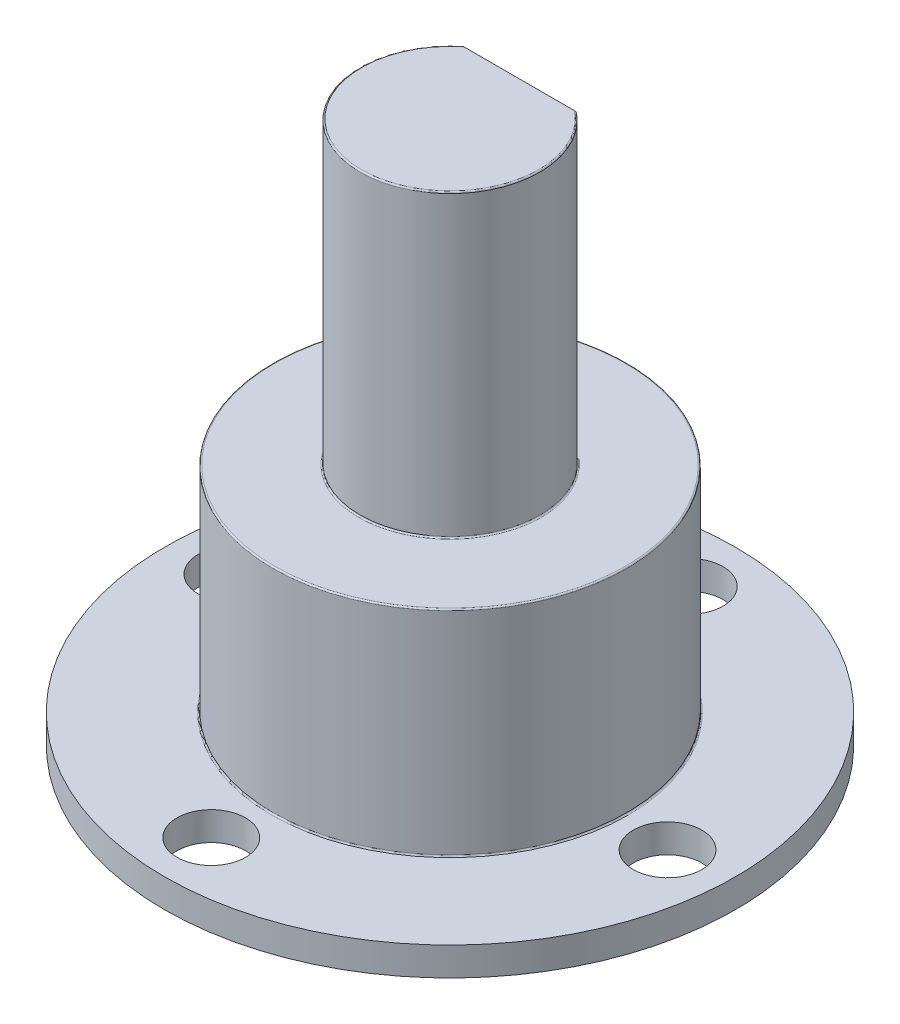
ISO-10303-21;
HEADER;
FILE_DESCRIPTION(('STEP AP214'),'2;1');
FILE_NAME('part.step','',(''),(''),'','','');
FILE_SCHEMA(('AUTOMOTIVE_DESIGN { 1 0 10303 214 1 1 1 1 }'));
ENDSEC;
DATA;
#1=APPLICATION_CONTEXT('core data for automotive mechanical design processes');
#2=APPLICATION_PROTOCOL_DEFINITION('international standard','automotive_design',2000,#1);
#3=PRODUCT_CONTEXT('',#1,'mechanical');
#4=PRODUCT('Part','Part','',(#3));
#5=PRODUCT_RELATED_PRODUCT_CATEGORY('part','',(#4));
#6=PRODUCT_DEFINITION_FORMATION('','',#4);
#7=PRODUCT_DEFINITION_CONTEXT('part definition',#1,'design');
#8=PRODUCT_DEFINITION('design','',#6,#7);
#9=PRODUCT_DEFINITION_SHAPE('','',#8);
#10=(LENGTH_UNIT() NAMED_UNIT(*) SI_UNIT(.MILLI.,.METRE.));
#11=(NAMED_UNIT(*) PLANE_ANGLE_UNIT() SI_UNIT($,.RADIAN.));
#12=(NAMED_UNIT(*) SI_UNIT($,.STERADIAN.) SOLID_ANGLE_UNIT());
#13=UNCERTAINTY_MEASURE_WITH_UNIT(LENGTH_MEASURE(1.E-05),#10,'distance_accuracy_value','');
#14=(GEOMETRIC_REPRESENTATION_CONTEXT(3) GLOBAL_UNCERTAINTY_ASSIGNED_CONTEXT((#13)) GLOBAL_UNIT_ASSIGNED_CONTEXT((#10,
#11,#12)) REPRESENTATION_CONTEXT('',''));
#15=CARTESIAN_POINT('',(0.,0.,0.));
#16=DIRECTION('',(0.,0.,1.));
#17=DIRECTION('',(1.,0.,0.));
#18=AXIS2_PLACEMENT_3D('',#15,#16,#17);
#19=CARTESIAN_POINT('',(0.,19.,0.));
#20=DIRECTION('',(0.,1.,0.));
#21=DIRECTION('',(0.,0.,1.));
#22=AXIS2_PLACEMENT_3D('',#19,#20,#21);
#23=PLANE('',#22);
#24=DIRECTION('',(1.,0.,0.));
#25=VECTOR('',#24,1.);
#26=CARTESIAN_POINT('',(-3.64134224162171,19.,-2.42190413345966));
#27=LINE('',#26,#25);
#28=CARTESIAN_POINT('',(-1.93504014643908,19.,-2.42190413345966));
#29=VERTEX_POINT('',#28);
#30=CARTESIAN_POINT('',(1.93504014643908,19.,-2.42190413345966));
#31=VERTEX_POINT('',#30);
#32=EDGE_CURVE('E195',#29,#31,#27,.T.);
#33=ORIENTED_EDGE('',*,*,#32,.F.);
#34=CARTESIAN_POINT('',(0.,19.,0.));
#35=DIRECTION('',(0.,1.,0.));
#36=DIRECTION('',(0.,0.,1.));
#37=AXIS2_PLACEMENT_3D('',#34,#35,#36);
#38=CIRCLE('',#37,3.1);
#39=EDGE_CURVE('E271',#29,#31,#38,.T.);
#40=ORIENTED_EDGE('',*,*,#39,.T.);
#41=EDGE_LOOP('',(#33,#40));
#42=FACE_BOUND('',#41,.T.);
#43=ADVANCED_FACE('F39',(#42),#23,.T.);
#44=CARTESIAN_POINT('',(0.,0.,0.));
#45=DIRECTION('',(0.,-1.,0.));
#46=DIRECTION('',(0.,0.,-1.));
#47=AXIS2_PLACEMENT_3D('',#44,#45,#46);
#48=CYLINDRICAL_SURFACE('',#47,3.15);
#49=DIRECTION('',(0.,-1.,0.));
#50=VECTOR('',#49,1.);
#51=CARTESIAN_POINT('',(2.01416989559744,0.,-2.42190413345966));
#52=LINE('',#51,#50);
#53=CARTESIAN_POINT('',(2.01416989559744,18.95,-2.42190413345966));
#54=VERTEX_POINT('',#53);
#55=CARTESIAN_POINT('',(2.01416989559744,8.55,-2.42190413345966));
#56=VERTEX_POINT('',#55);
#57=EDGE_CURVE('E100',#54,#56,#52,.T.);
#58=ORIENTED_EDGE('',*,*,#57,.F.);
#59=CARTESIAN_POINT('',(0.,18.95,0.));
#60=DIRECTION('',(0.,1.,0.));
#61=DIRECTION('',(0.,0.,1.));
#62=AXIS2_PLACEMENT_3D('',#59,#60,#61);
#63=CIRCLE('',#62,3.15);
#64=CARTESIAN_POINT('',(-2.01416989559744,18.95,-2.42190413345966));
#65=VERTEX_POINT('',#64);
#66=EDGE_CURVE('E97',#54,#65,#63,.F.);
#67=ORIENTED_EDGE('',*,*,#66,.T.);
#68=DIRECTION('',(0.,-1.,0.));
#69=VECTOR('',#68,1.);
#70=CARTESIAN_POINT('',(-2.01416989559744,0.,-2.42190413345966));
#71=LINE('',#70,#69);
#72=CARTESIAN_POINT('',(-2.01416989559744,8.55,-2.42190413345966));
#73=VERTEX_POINT('',#72);
#74=EDGE_CURVE('E84',#73,#65,#71,.F.);
#75=ORIENTED_EDGE('',*,*,#74,.F.);
#76=CARTESIAN_POINT('',(0.,8.55,0.));
#77=DIRECTION('',(0.,1.,0.));
#78=DIRECTION('',(0.,0.,1.));
#79=AXIS2_PLACEMENT_3D('',#76,#77,#78);
#80=CIRCLE('',#79,3.15);
#81=EDGE_CURVE('E94',#73,#56,#80,.T.);
#82=ORIENTED_EDGE('',*,*,#81,.T.);
#83=EDGE_LOOP('',(#58,#67,#75,#82));
#84=FACE_BOUND('',#83,.T.);
#85=ADVANCED_FACE('F93',(#84),#48,.T.);
#86=CARTESIAN_POINT('',(3.15,8.5,0.));
#87=DIRECTION('',(0.,1.,0.));
#88=DIRECTION('',(0.,0.,1.));
#89=AXIS2_PLACEMENT_3D('',#86,#87,#88);
#90=PLANE('',#89);
#91=CARTESIAN_POINT('',(0.,8.5,0.));
#92=DIRECTION('',(0.,1.,0.));
#93=DIRECTION('',(0.,0.,1.));
#94=AXIS2_PLACEMENT_3D('',#91,#92,#93);
#95=CIRCLE('',#94,6.15);
#96=CARTESIAN_POINT('',(0.,8.5,6.15));
#97=VERTEX_POINT('',#96);
#98=EDGE_CURVE('E273',#97,#97,#95,.T.);
#99=ORIENTED_EDGE('',*,*,#98,.T.);
#100=EDGE_LOOP('',(#99));
#101=FACE_BOUND('',#100,.T.);
#102=CARTESIAN_POINT('',(0.,8.5,0.));
#103=DIRECTION('',(0.,1.,0.));
#104=DIRECTION('',(0.,0.,1.));
#105=AXIS2_PLACEMENT_3D('',#102,#103,#104);
#106=CIRCLE('',#105,3.2);
#107=CARTESIAN_POINT('',(2.09150194079063,8.5,-2.42190413345966));
#108=VERTEX_POINT('',#107);
#109=CARTESIAN_POINT('',(-2.09150194079063,8.5,-2.42190413345966));
#110=VERTEX_POINT('',#109);
#111=EDGE_CURVE('E277',#108,#110,#106,.F.);
#112=ORIENTED_EDGE('',*,*,#111,.T.);
#113=DIRECTION('',(-1.,0.,0.));
#114=VECTOR('',#113,1.);
#115=CARTESIAN_POINT('',(-3.64134224162171,8.5,-2.42190413345966));
#116=LINE('',#115,#114);
#117=EDGE_CURVE('E60',#108,#110,#116,.T.);
#118=ORIENTED_EDGE('',*,*,#117,.F.);
#119=EDGE_LOOP('',(#112,#118));
#120=FACE_BOUND('',#119,.T.);
#121=ADVANCED_FACE('F165',(#101,#120),#90,.T.);
#122=CARTESIAN_POINT('',(0.,0.,0.));
#123=DIRECTION('',(0.,-1.,0.));
#124=DIRECTION('',(0.,0.,-1.));
#125=AXIS2_PLACEMENT_3D('',#122,#123,#124);
#126=CYLINDRICAL_SURFACE('',#125,6.2);
#127=CARTESIAN_POINT('',(0.,8.45,0.));
#128=DIRECTION('',(0.,1.,0.));
#129=DIRECTION('',(0.,0.,1.));
#130=AXIS2_PLACEMENT_3D('',#127,#128,#129);
#131=CIRCLE('',#130,6.2);
#132=CARTESIAN_POINT('',(0.,8.45,6.2));
#133=VERTEX_POINT('',#132);
#134=EDGE_CURVE('E285',#133,#133,#131,.F.);
#135=ORIENTED_EDGE('',*,*,#134,.T.);
#136=EDGE_LOOP('',(#135));
#137=FACE_BOUND('',#136,.T.);
#138=CARTESIAN_POINT('',(0.,1.05,0.));
#139=DIRECTION('',(0.,1.,0.));
#140=DIRECTION('',(0.,0.,1.));
#141=AXIS2_PLACEMENT_3D('',#138,#139,#140);
#142=CIRCLE('',#141,6.2);
#143=CARTESIAN_POINT('',(0.,1.05,6.2));
#144=VERTEX_POINT('',#143);
#145=EDGE_CURVE('E282',#144,#144,#142,.T.);
#146=ORIENTED_EDGE('',*,*,#145,.T.);
#147=EDGE_LOOP('',(#146));
#148=FACE_BOUND('',#147,.T.);
#149=ADVANCED_FACE('F171',(#137,#148),#126,.T.);
#150=CARTESIAN_POINT('',(6.2,1.,0.));
#151=DIRECTION('',(0.,1.,0.));
#152=DIRECTION('',(0.,0.,1.));
#153=AXIS2_PLACEMENT_3D('',#150,#151,#152);
#154=PLANE('',#153);
#155=CARTESIAN_POINT('',(0.,1.,0.));
#156=DIRECTION('',(0.,1.,0.));
#157=DIRECTION('',(0.,0.,1.));
#158=AXIS2_PLACEMENT_3D('',#155,#156,#157);
#159=CIRCLE('',#158,6.25);
#160=CARTESIAN_POINT('',(0.,1.,6.25));
#161=VERTEX_POINT('',#160);
#162=EDGE_CURVE('E89',#161,#161,#159,.F.);
#163=ORIENTED_EDGE('',*,*,#162,.T.);
#164=EDGE_LOOP('',(#163));
#165=FACE_BOUND('',#164,.T.);
#166=CARTESIAN_POINT('',(-7.99137872735473,1.,-0.371303159133185));
#167=DIRECTION('',(0.,1.,0.));
#168=DIRECTION('',(0.,0.,1.));
#169=AXIS2_PLACEMENT_3D('',#166,#167,#168);
#170=CIRCLE('',#169,1.2);
#171=CARTESIAN_POINT('',(-7.99137872735473,1.,0.828696840866815));
#172=VERTEX_POINT('',#171);
#173=EDGE_CURVE('E229',#172,#172,#170,.T.);
#174=ORIENTED_EDGE('',*,*,#173,.F.);
#175=EDGE_LOOP('',(#174));
#176=FACE_BOUND('',#175,.T.);
#177=CARTESIAN_POINT('',(-0.371303159133101,1.,7.99137872735473));
#178=DIRECTION('',(0.,1.,0.));
#179=DIRECTION('',(0.,0.,1.));
#180=AXIS2_PLACEMENT_3D('',#177,#178,#179);
#181=CIRCLE('',#180,1.2);
#182=CARTESIAN_POINT('',(-0.371303159133101,1.,9.19137872735473));
#183=VERTEX_POINT('',#182);
#184=EDGE_CURVE('E221',#183,#183,#181,.T.);
#185=ORIENTED_EDGE('',*,*,#184,.F.);
#186=EDGE_LOOP('',(#185));
#187=FACE_BOUND('',#186,.T.);
#188=CARTESIAN_POINT('',(7.99137872735473,1.,0.371303159133129));
#189=DIRECTION('',(0.,1.,0.));
#190=DIRECTION('',(0.,0.,1.));
#191=AXIS2_PLACEMENT_3D('',#188,#189,#190);
#192=CIRCLE('',#191,1.2);
#193=CARTESIAN_POINT('',(7.99137872735473,1.,1.57130315913313));
#194=VERTEX_POINT('',#193);
#195=EDGE_CURVE('E213',#194,#194,#192,.T.);
#196=ORIENTED_EDGE('',*,*,#195,.F.);
#197=EDGE_LOOP('',(#196));
#198=FACE_BOUND('',#197,.T.);
#199=CARTESIAN_POINT('',(0.371303159133101,1.,-7.99137872735473));
#200=DIRECTION('',(0.,1.,0.));
#201=DIRECTION('',(0.,0.,1.));
#202=AXIS2_PLACEMENT_3D('',#199,#200,#201);
#203=CIRCLE('',#202,1.2);
#204=CARTESIAN_POINT('',(0.371303159133101,1.,-6.79137872735473));
#205=VERTEX_POINT('',#204);
#206=EDGE_CURVE('E205',#205,#205,#203,.T.);
#207=ORIENTED_EDGE('',*,*,#206,.F.);
#208=EDGE_LOOP('',(#207));
#209=FACE_BOUND('',#208,.T.);
#210=CARTESIAN_POINT('',(0.,1.,0.));
#211=DIRECTION('',(0.,-1.,0.));
#212=DIRECTION('',(0.,0.,-1.));
#213=AXIS2_PLACEMENT_3D('',#210,#211,#212);
#214=CIRCLE('',#213,10.);
#215=CARTESIAN_POINT('',(0.,1.,-10.));
#216=VERTEX_POINT('',#215);
#217=EDGE_CURVE('E105',#216,#216,#214,.T.);
#218=ORIENTED_EDGE('',*,*,#217,.F.);
#219=EDGE_LOOP('',(#218));
#220=FACE_BOUND('',#219,.T.);
#221=ADVANCED_FACE('F175',(#165,#176,#187,#198,#209,#220),#154,.T.);
#222=CARTESIAN_POINT('',(0.,0.,0.));
#223=DIRECTION('',(0.,-1.,0.));
#224=DIRECTION('',(0.,0.,-1.));
#225=AXIS2_PLACEMENT_3D('',#222,#223,#224);
#226=CYLINDRICAL_SURFACE('',#225,10.);
#227=ORIENTED_EDGE('',*,*,#217,.T.);
#228=EDGE_LOOP('',(#227));
#229=FACE_BOUND('',#228,.T.);
#230=CARTESIAN_POINT('',(0.,0.,0.));
#231=DIRECTION('',(0.,-1.,0.));
#232=DIRECTION('',(0.,0.,-1.));
#233=AXIS2_PLACEMENT_3D('',#230,#231,#232);
#234=CIRCLE('',#233,10.);
#235=CARTESIAN_POINT('',(0.,0.,-10.));
#236=VERTEX_POINT('',#235);
#237=EDGE_CURVE('E99',#236,#236,#234,.T.);
#238=ORIENTED_EDGE('',*,*,#237,.F.);
#239=EDGE_LOOP('',(#238));
#240=FACE_BOUND('',#239,.T.);
#241=ADVANCED_FACE('F178',(#229,#240),#226,.T.);
#242=CARTESIAN_POINT('',(10.,0.,0.));
#243=DIRECTION('',(0.,-1.,0.));
#244=DIRECTION('',(0.,0.,-1.));
#245=AXIS2_PLACEMENT_3D('',#242,#243,#244);
#246=PLANE('',#245);
#247=CARTESIAN_POINT('',(-7.99137872735473,0.,-0.371303159133185));
#248=DIRECTION('',(0.,-1.,0.));
#249=DIRECTION('',(0.,0.,-1.));
#250=AXIS2_PLACEMENT_3D('',#247,#248,#249);
#251=CIRCLE('',#250,1.2);
#252=CARTESIAN_POINT('',(-7.99137872735473,0.,-1.57130315913318));
#253=VERTEX_POINT('',#252);
#254=EDGE_CURVE('E225',#253,#253,#251,.T.);
#255=ORIENTED_EDGE('',*,*,#254,.F.);
#256=EDGE_LOOP('',(#255));
#257=FACE_BOUND('',#256,.T.);
#258=CARTESIAN_POINT('',(-0.371303159133101,0.,7.99137872735473));
#259=DIRECTION('',(0.,-1.,0.));
#260=DIRECTION('',(0.,0.,-1.));
#261=AXIS2_PLACEMENT_3D('',#258,#259,#260);
#262=CIRCLE('',#261,1.2);
#263=CARTESIAN_POINT('',(-0.371303159133101,0.,6.79137872735473));
#264=VERTEX_POINT('',#263);
#265=EDGE_CURVE('E217',#264,#264,#262,.T.);
#266=ORIENTED_EDGE('',*,*,#265,.F.);
#267=EDGE_LOOP('',(#266));
#268=FACE_BOUND('',#267,.T.);
#269=CARTESIAN_POINT('',(7.99137872735473,0.,0.371303159133129));
#270=DIRECTION('',(0.,-1.,0.));
#271=DIRECTION('',(0.,0.,-1.));
#272=AXIS2_PLACEMENT_3D('',#269,#270,#271);
#273=CIRCLE('',#272,1.2);
#274=CARTESIAN_POINT('',(7.99137872735473,0.,-0.82869684086687));
#275=VERTEX_POINT('',#274);
#276=EDGE_CURVE('E209',#275,#275,#273,.T.);
#277=ORIENTED_EDGE('',*,*,#276,.F.);
#278=EDGE_LOOP('',(#277));
#279=FACE_BOUND('',#278,.T.);
#280=CARTESIAN_POINT('',(0.371303159133101,0.,-7.99137872735473));
#281=DIRECTION('',(0.,-1.,0.));
#282=DIRECTION('',(0.,0.,-1.));
#283=AXIS2_PLACEMENT_3D('',#280,#281,#282);
#284=CIRCLE('',#283,1.2);
#285=CARTESIAN_POINT('',(0.371303159133101,0.,-9.19137872735473));
#286=VERTEX_POINT('',#285);
#287=EDGE_CURVE('E199',#286,#286,#284,.T.);
#288=ORIENTED_EDGE('',*,*,#287,.F.);
#289=EDGE_LOOP('',(#288));
#290=FACE_BOUND('',#289,.T.);
#291=ORIENTED_EDGE('',*,*,#237,.T.);
#292=EDGE_LOOP('',(#291));
#293=FACE_BOUND('',#292,.T.);
#294=ADVANCED_FACE('F136',(#257,#268,#279,#290,#293),#246,.T.);
#295=CARTESIAN_POINT('',(-3.64134224162171,1.7776982286854,-2.42190413345966));
#296=DIRECTION('',(0.,0.,1.));
#297=DIRECTION('',(1.,0.,0.));
#298=AXIS2_PLACEMENT_3D('',#295,#296,#297);
#299=PLANE('',#298);
#300=ORIENTED_EDGE('',*,*,#74,.T.);
#301=CARTESIAN_POINT('',(-2.01416989559744,18.95,-2.42190413345966));
#302=CARTESIAN_POINT('',(-2.01417590237611,18.9521216830641,-2.42190413345966));
#303=CARTESIAN_POINT('',(-2.01395911672371,18.9542362565048,-2.42190413345966));
#304=CARTESIAN_POINT('',(-2.01313385755975,18.9583653469993,-2.42190413345966));
#305=CARTESIAN_POINT('',(-2.01252956095126,18.9603806871485,-2.42190413345966));
#306=CARTESIAN_POINT('',(-2.01098410194977,18.9642657850124,-2.42190413345966));
#307=CARTESIAN_POINT('',(-2.0100442207675,18.9661360639363,-2.42190413345966));
#308=CARTESIAN_POINT('',(-2.00789099026722,18.9697159538891,-2.42190413345966));
#309=CARTESIAN_POINT('',(-2.00667687582769,18.9714250960574,-2.42190413345966));
#310=CARTESIAN_POINT('',(-2.00338506976665,18.9754672746997,-2.42190413345966));
#311=CARTESIAN_POINT('',(-2.00117643251855,18.9776934145825,-2.42190413345966));
#312=CARTESIAN_POINT('',(-1.99643926205854,18.9817710648431,-2.42190413345966));
#313=CARTESIAN_POINT('',(-1.99391010489922,18.9836218256981,-2.42190413345966));
#314=CARTESIAN_POINT('',(-1.98725433870058,18.9878621134624,-2.42190413345966));
#315=CARTESIAN_POINT('',(-1.98298472824473,18.9900262882537,-2.42190413345966));
#316=CARTESIAN_POINT('',(-1.9741603474674,18.9936763378202,-2.42190413345966));
#317=CARTESIAN_POINT('',(-1.96960467061184,18.9951599182598,-2.42190413345966));
#318=CARTESIAN_POINT('',(-1.96006551370825,18.9975952002509,-2.42190413345966));
#319=CARTESIAN_POINT('',(-1.95507274239813,18.99850978958,-2.42190413345966));
#320=CARTESIAN_POINT('',(-1.94506350299754,18.9997060938125,-2.42190413345966));
#321=CARTESIAN_POINT('',(-1.9400478224935,18.9999942970851,-2.42190413345966));
#322=CARTESIAN_POINT('',(-1.93504014643969,19.0000000000024,-2.42190413345966));
#323=B_SPLINE_CURVE_WITH_KNOTS('',3,(#301,#302,#303,#304,#305,#306,#307,#308,#309,#310,#311,
#312,#313,#314,#315,#316,#317,#318,#319,#320,#321,#322),.UNSPECIFIED.,.F.,.F.,(4,2,2,2,2,2,2,2,
2,2,4),(0.,0.00634273226889814,0.012618221112652,0.0188700028781376,0.0251394476725693,
0.0344942343102322,0.0438675197383147,0.0581489993796762,0.0724782754562997,0.0876644527897368,
0.102692560360126),.UNSPECIFIED.);
#324=EDGE_CURVE('E122',#65,#29,#323,.T.);
#325=ORIENTED_EDGE('',*,*,#324,.T.);
#326=ORIENTED_EDGE('',*,*,#32,.T.);
#327=CARTESIAN_POINT('',(1.93504014643908,19.,-2.42190413345966));
#328=CARTESIAN_POINT('',(1.9418884795616,18.9999797110995,-2.42190413345966));
#329=CARTESIAN_POINT('',(1.94878601283452,18.9994465858052,-2.42190413345966));
#330=CARTESIAN_POINT('',(1.96246409628458,18.9971729364779,-2.42190413345966));
#331=CARTESIAN_POINT('',(1.96924200411268,18.9954169846787,-2.42190413345966));
#332=CARTESIAN_POINT('',(1.97919852531104,18.9916661012743,-2.42190413345966));
#333=CARTESIAN_POINT('',(1.98256612796618,18.9901750768464,-2.42190413345966));
#334=CARTESIAN_POINT('',(1.98906382882479,18.9867535648226,-2.42190413345966));
#335=CARTESIAN_POINT('',(1.99219464353367,18.9848244800279,-2.42190413345966));
#336=CARTESIAN_POINT('',(1.99742140895632,18.9809695256451,-2.42190413345966));
#337=CARTESIAN_POINT('',(1.99959044883741,18.9791434441421,-2.42190413345966));
#338=CARTESIAN_POINT('',(2.00362038574404,18.9751743375611,-2.42190413345966));
#339=CARTESIAN_POINT('',(2.00548166137603,18.9730317081357,-2.42190413345966));
#340=CARTESIAN_POINT('',(2.00833837363689,18.9690311411295,-2.42190413345966));
#341=CARTESIAN_POINT('',(2.00943306007168,18.9672443976272,-2.42190413345966));
#342=CARTESIAN_POINT('',(2.01131803815089,18.9635193981071,-2.42190413345966));
#343=CARTESIAN_POINT('',(2.01210914155116,18.9615815630485,-2.42190413345966));
#344=CARTESIAN_POINT('',(2.0131912573456,18.9580408347422,-2.42190413345966));
#345=CARTESIAN_POINT('',(2.01355455656631,18.9564600043746,-2.42190413345966));
#346=CARTESIAN_POINT('',(2.01404561838081,18.9532537312903,-2.42190413345966));
#347=CARTESIAN_POINT('',(2.01417209676778,18.9516280935668,-2.42190413345966));
#348=CARTESIAN_POINT('',(2.01416989561043,18.950000000004,-2.42190413345966));
#349=B_SPLINE_CURVE_WITH_KNOTS('',3,(#327,#328,#329,#330,#331,#332,#333,#334,#335,#336,#337,
#338,#339,#340,#341,#342,#343,#344,#345,#346,#347,#348),.UNSPECIFIED.,.F.,.F.,(4,2,2,2,2,2,2,2,
2,2,4),(0.,0.0206100752579521,0.0414850024725544,0.0525079464908581,0.0634960774351003,
0.0719759123297831,0.0804452365862247,0.0867087405057899,0.0929553776568623,0.0978044445981582,
0.102679731233965),.UNSPECIFIED.);
#350=EDGE_CURVE('E109',#31,#54,#349,.T.);
#351=ORIENTED_EDGE('',*,*,#350,.T.);
#352=ORIENTED_EDGE('',*,*,#57,.T.);
#353=CARTESIAN_POINT('',(2.01416989559744,8.55,-2.42190413345966));
#354=CARTESIAN_POINT('',(2.01416375080115,8.54787045020707,-2.42190413345966));
#355=CARTESIAN_POINT('',(2.0143822432021,8.54574829513669,-2.42190413345966));
#356=CARTESIAN_POINT('',(2.0152130590764,8.54160525846304,-2.42190413345966));
#357=CARTESIAN_POINT('',(2.01582109365644,8.53958352924039,-2.42190413345966));
#358=CARTESIAN_POINT('',(2.0173745935777,8.53568665609457,-2.42190413345966));
#359=CARTESIAN_POINT('',(2.01831872381318,8.53381096746484,-2.42190413345966));
#360=CARTESIAN_POINT('',(2.02048009728128,8.53021999117104,-2.42190413345966));
#361=CARTESIAN_POINT('',(2.02169812443662,8.52850518433883,-2.42190413345966));
#362=CARTESIAN_POINT('',(2.02501346901599,8.52442992543303,-2.42190413345966));
#363=CARTESIAN_POINT('',(2.02724483126496,8.52217878225275,-2.42190413345966));
#364=CARTESIAN_POINT('',(2.03203085084424,8.51805424754571,-2.42190413345966));
#365=CARTESIAN_POINT('',(2.03458616786284,8.51618164764608,-2.42190413345966));
#366=CARTESIAN_POINT('',(2.04127117938197,8.51191746104592,-2.42190413345966));
#367=CARTESIAN_POINT('',(2.04554083701177,8.5097460011517,-2.42190413345966));
#368=CARTESIAN_POINT('',(2.05436646202734,8.50608737505192,-2.42190413345966));
#369=CARTESIAN_POINT('',(2.05892319370602,8.50460213154385,-2.42190413345966));
#370=CARTESIAN_POINT('',(2.06813792009235,8.50226696922212,-2.42190413345966));
#371=CARTESIAN_POINT('',(2.07279413682753,8.50140990907362,-2.42190413345966));
#372=CARTESIAN_POINT('',(2.08213608659994,8.50028128122227,-2.42190413345966));
#373=CARTESIAN_POINT('',(2.08682119893017,8.50000462558101,-2.42190413345966));
#374=CARTESIAN_POINT('',(2.09150194079008,8.49999999999782,-2.42190413345966));
#375=B_SPLINE_CURVE_WITH_KNOTS('',3,(#353,#354,#355,#356,#357,#358,#359,#360,#361,#362,#363,
#364,#365,#366,#367,#368,#369,#370,#371,#372,#373,#374),.UNSPECIFIED.,.F.,.F.,(4,2,2,2,2,2,2,2,
2,2,4),(0.,0.00636574946126845,0.0126625885841997,0.0189346882720301,0.0252249731858343,
0.0346804766431191,0.0441555538549263,0.0584475397049303,0.0727793307309555,0.0869455545208311,
0.100987066475824),.UNSPECIFIED.);
#376=EDGE_CURVE('E11',#56,#108,#375,.T.);
#377=ORIENTED_EDGE('',*,*,#376,.T.);
#378=ORIENTED_EDGE('',*,*,#117,.T.);
#379=CARTESIAN_POINT('',(-2.09150194079063,8.5,-2.42190413345966));
#380=CARTESIAN_POINT('',(-2.08511409521598,8.50001621423212,-2.42190413345966));
#381=CARTESIAN_POINT('',(-2.07869471576394,8.50052648826963,-2.42190413345966));
#382=CARTESIAN_POINT('',(-2.06596628688382,8.50264746767663,-2.42190413345966));
#383=CARTESIAN_POINT('',(-2.05965943695206,8.50427110274127,-2.42190413345966));
#384=CARTESIAN_POINT('',(-2.04994238179785,8.50783661385341,-2.42190413345966));
#385=CARTESIAN_POINT('',(-2.04638855644225,8.50938696380156,-2.42190413345966));
#386=CARTESIAN_POINT('',(-2.03954033704539,8.51297116439011,-2.42190413345966));
#387=CARTESIAN_POINT('',(-2.03624510969249,8.51500336930857,-2.42190413345966));
#388=CARTESIAN_POINT('',(-2.03089811026372,8.51898165874706,-2.42190413345966));
#389=CARTESIAN_POINT('',(-2.02875209764491,8.52080047405265,-2.42190413345966));
#390=CARTESIAN_POINT('',(-2.02476096129706,8.52474643740301,-2.42190413345966));
#391=CARTESIAN_POINT('',(-2.0229154902629,8.52687322410733,-2.42190413345966));
#392=CARTESIAN_POINT('',(-2.0200576708834,8.53086533674746,-2.42190413345966));
#393=CARTESIAN_POINT('',(-2.01895231407341,8.53266373673204,-2.42190413345966));
#394=CARTESIAN_POINT('',(-2.01704820175916,8.53641359302878,-2.42190413345966));
#395=CARTESIAN_POINT('',(-2.01624860618062,8.53836461197203,-2.42190413345966));
#396=CARTESIAN_POINT('',(-2.01515663114383,8.54192537983839,-2.42190413345966));
#397=CARTESIAN_POINT('',(-2.01479043508984,8.54351250936921,-2.42190413345966));
#398=CARTESIAN_POINT('',(-2.01429526220416,8.5467321056509,-2.42190413345966));
#399=CARTESIAN_POINT('',(-2.01416762156093,8.54836477609222,-2.42190413345966));
#400=CARTESIAN_POINT('',(-2.01416989559007,8.54999999999774,-2.42190413345966));
#401=B_SPLINE_CURVE_WITH_KNOTS('',3,(#379,#380,#381,#382,#383,#384,#385,#386,#387,#388,#389,
#390,#391,#392,#393,#394,#395,#396,#397,#398,#399,#400),.UNSPECIFIED.,.F.,.F.,(4,2,2,2,2,2,2,2,
2,2,4),(0.,0.0191992509703676,0.0386253292767722,0.0502276900527539,0.0617909809986993,
0.0702051651229693,0.0786095557605545,0.0849194969029147,0.0912119748389958,0.0960812340216025,
0.100977685931163),.UNSPECIFIED.);
#402=EDGE_CURVE('E54',#110,#73,#401,.T.);
#403=ORIENTED_EDGE('',*,*,#402,.T.);
#404=EDGE_LOOP('',(#300,#325,#326,#351,#352,#377,#378,#403));
#405=FACE_BOUND('',#404,.T.);
#406=ADVANCED_FACE('F83',(#405),#299,.F.);
#407=CARTESIAN_POINT('',(0.371303159133101,1.,-7.99137872735473));
#408=DIRECTION('',(0.,1.,0.));
#409=DIRECTION('',(0.,0.,1.));
#410=AXIS2_PLACEMENT_3D('',#407,#408,#409);
#411=CYLINDRICAL_SURFACE('',#410,1.2);
#412=ORIENTED_EDGE('',*,*,#206,.T.);
#413=EDGE_LOOP('',(#412));
#414=FACE_BOUND('',#413,.T.);
#415=ORIENTED_EDGE('',*,*,#287,.T.);
#416=EDGE_LOOP('',(#415));
#417=FACE_BOUND('',#416,.T.);
#418=ADVANCED_FACE('F135',(#414,#417),#411,.F.);
#419=CARTESIAN_POINT('',(7.99137872735473,1.,0.371303159133129));
#420=DIRECTION('',(0.,1.,0.));
#421=DIRECTION('',(0.,0.,1.));
#422=AXIS2_PLACEMENT_3D('',#419,#420,#421);
#423=CYLINDRICAL_SURFACE('',#422,1.2);
#424=ORIENTED_EDGE('',*,*,#195,.T.);
#425=EDGE_LOOP('',(#424));
#426=FACE_BOUND('',#425,.T.);
#427=ORIENTED_EDGE('',*,*,#276,.T.);
#428=EDGE_LOOP('',(#427));
#429=FACE_BOUND('',#428,.T.);
#430=ADVANCED_FACE('F247',(#426,#429),#423,.F.);
#431=CARTESIAN_POINT('',(-0.371303159133101,1.,7.99137872735473));
#432=DIRECTION('',(0.,1.,0.));
#433=DIRECTION('',(0.,0.,1.));
#434=AXIS2_PLACEMENT_3D('',#431,#432,#433);
#435=CYLINDRICAL_SURFACE('',#434,1.2);
#436=ORIENTED_EDGE('',*,*,#184,.T.);
#437=EDGE_LOOP('',(#436));
#438=FACE_BOUND('',#437,.T.);
#439=ORIENTED_EDGE('',*,*,#265,.T.);
#440=EDGE_LOOP('',(#439));
#441=FACE_BOUND('',#440,.T.);
#442=ADVANCED_FACE('F253',(#438,#441),#435,.F.);
#443=CARTESIAN_POINT('',(-7.99137872735473,1.,-0.371303159133185));
#444=DIRECTION('',(0.,1.,0.));
#445=DIRECTION('',(0.,0.,1.));
#446=AXIS2_PLACEMENT_3D('',#443,#444,#445);
#447=CYLINDRICAL_SURFACE('',#446,1.2);
#448=ORIENTED_EDGE('',*,*,#173,.T.);
#449=EDGE_LOOP('',(#448));
#450=FACE_BOUND('',#449,.T.);
#451=ORIENTED_EDGE('',*,*,#254,.T.);
#452=EDGE_LOOP('',(#451));
#453=FACE_BOUND('',#452,.T.);
#454=ADVANCED_FACE('F234',(#450,#453),#447,.F.);
#455=CARTESIAN_POINT('',(0.,18.95,0.));
#456=DIRECTION('',(0.,1.,0.));
#457=DIRECTION('',(0.,0.,1.));
#458=AXIS2_PLACEMENT_3D('',#455,#456,#457);
#459=TOROIDAL_SURFACE('',#458,3.1,0.05);
#460=ORIENTED_EDGE('',*,*,#350,.F.);
#461=ORIENTED_EDGE('',*,*,#39,.F.);
#462=ORIENTED_EDGE('',*,*,#324,.F.);
#463=ORIENTED_EDGE('',*,*,#66,.F.);
#464=EDGE_LOOP('',(#460,#461,#462,#463));
#465=FACE_BOUND('',#464,.T.);
#466=ADVANCED_FACE('F128',(#465),#459,.T.);
#467=CARTESIAN_POINT('',(0.,8.55,0.));
#468=DIRECTION('',(0.,1.,0.));
#469=DIRECTION('',(0.,0.,1.));
#470=AXIS2_PLACEMENT_3D('',#467,#468,#469);
#471=TOROIDAL_SURFACE('',#470,3.2,0.05);
#472=ORIENTED_EDGE('',*,*,#376,.F.);
#473=ORIENTED_EDGE('',*,*,#81,.F.);
#474=ORIENTED_EDGE('',*,*,#402,.F.);
#475=ORIENTED_EDGE('',*,*,#111,.F.);
#476=EDGE_LOOP('',(#472,#473,#474,#475));
#477=FACE_BOUND('',#476,.T.);
#478=ADVANCED_FACE('F103',(#477),#471,.F.);
#479=CARTESIAN_POINT('',(0.,8.45,0.));
#480=DIRECTION('',(0.,1.,0.));
#481=DIRECTION('',(0.,0.,1.));
#482=AXIS2_PLACEMENT_3D('',#479,#480,#481);
#483=TOROIDAL_SURFACE('',#482,6.15,0.05);
#484=ORIENTED_EDGE('',*,*,#98,.F.);
#485=EDGE_LOOP('',(#484));
#486=FACE_BOUND('',#485,.T.);
#487=ORIENTED_EDGE('',*,*,#134,.F.);
#488=EDGE_LOOP('',(#487));
#489=FACE_BOUND('',#488,.T.);
#490=ADVANCED_FACE('F150',(#486,#489),#483,.T.);
#491=CARTESIAN_POINT('',(0.,1.05,0.));
#492=DIRECTION('',(0.,1.,0.));
#493=DIRECTION('',(0.,0.,1.));
#494=AXIS2_PLACEMENT_3D('',#491,#492,#493);
#495=TOROIDAL_SURFACE('',#494,6.25,0.05);
#496=ORIENTED_EDGE('',*,*,#145,.F.);
#497=EDGE_LOOP('',(#496));
#498=FACE_BOUND('',#497,.T.);
#499=ORIENTED_EDGE('',*,*,#162,.F.);
#500=EDGE_LOOP('',(#499));
#501=FACE_BOUND('',#500,.T.);
#502=ADVANCED_FACE('F41',(#498,#501),#495,.F.);
#503=CLOSED_SHELL('',(#43,#85,#121,#149,#221,#241,#294,#406,#418,#430,#442,#454,#466,#478,#490,#502));
#504=MANIFOLD_SOLID_BREP('B2',#503);
#505=ADVANCED_BREP_SHAPE_REPRESENTATION('',(#18,#504),#14);
#506=SHAPE_DEFINITION_REPRESENTATION(#9,#505);
ENDSEC;
END-ISO-10303-21;
